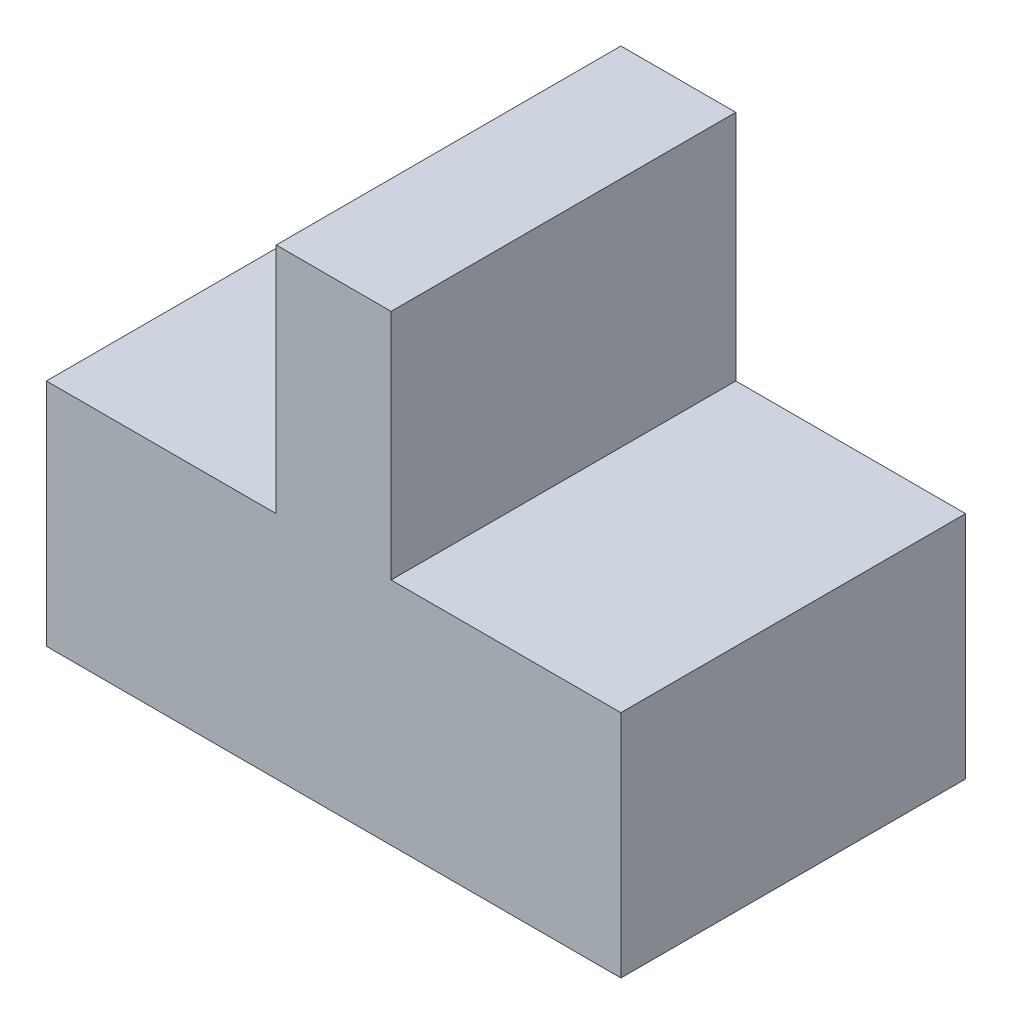
ISO-10303-21;
HEADER;
FILE_DESCRIPTION(('STEP AP214'),'2;1');
FILE_NAME('part.step','',(''),(''),'','','');
FILE_SCHEMA(('AUTOMOTIVE_DESIGN { 1 0 10303 214 1 1 1 1 }'));
ENDSEC;
DATA;
#1=APPLICATION_CONTEXT('core data for automotive mechanical design processes');
#2=APPLICATION_PROTOCOL_DEFINITION('international standard','automotive_design',2000,#1);
#3=PRODUCT_CONTEXT('',#1,'mechanical');
#4=PRODUCT('Part','Part','',(#3));
#5=PRODUCT_RELATED_PRODUCT_CATEGORY('part','',(#4));
#6=PRODUCT_DEFINITION_FORMATION('','',#4);
#7=PRODUCT_DEFINITION_CONTEXT('part definition',#1,'design');
#8=PRODUCT_DEFINITION('design','',#6,#7);
#9=PRODUCT_DEFINITION_SHAPE('','',#8);
#10=(LENGTH_UNIT() NAMED_UNIT(*) SI_UNIT(.MILLI.,.METRE.));
#11=(NAMED_UNIT(*) PLANE_ANGLE_UNIT() SI_UNIT($,.RADIAN.));
#12=(NAMED_UNIT(*) SI_UNIT($,.STERADIAN.) SOLID_ANGLE_UNIT());
#13=UNCERTAINTY_MEASURE_WITH_UNIT(LENGTH_MEASURE(1.E-05),#10,'distance_accuracy_value','');
#14=(GEOMETRIC_REPRESENTATION_CONTEXT(3) GLOBAL_UNCERTAINTY_ASSIGNED_CONTEXT((#13)) GLOBAL_UNIT_ASSIGNED_CONTEXT((#10,
#11,#12)) REPRESENTATION_CONTEXT('',''));
#15=CARTESIAN_POINT('',(0.,0.,0.));
#16=DIRECTION('',(0.,0.,1.));
#17=DIRECTION('',(1.,0.,0.));
#18=AXIS2_PLACEMENT_3D('',#15,#16,#17);
#19=CARTESIAN_POINT('',(0.,20.,30.));
#20=DIRECTION('',(1.,0.,0.));
#21=DIRECTION('',(0.,1.,0.));
#22=AXIS2_PLACEMENT_3D('',#19,#20,#21);
#23=PLANE('',#22);
#24=DIRECTION('',(0.,-1.,0.));
#25=VECTOR('',#24,1.);
#26=CARTESIAN_POINT('',(0.,20.,0.));
#27=LINE('',#26,#25);
#28=CARTESIAN_POINT('',(0.,20.,0.));
#29=VERTEX_POINT('',#28);
#30=CARTESIAN_POINT('',(0.,0.,0.));
#31=VERTEX_POINT('',#30);
#32=EDGE_CURVE('E144',#29,#31,#27,.T.);
#33=ORIENTED_EDGE('',*,*,#32,.T.);
#34=DIRECTION('',(0.,0.,-1.));
#35=VECTOR('',#34,1.);
#36=CARTESIAN_POINT('',(0.,0.,30.));
#37=LINE('',#36,#35);
#38=CARTESIAN_POINT('',(0.,0.,30.));
#39=VERTEX_POINT('',#38);
#40=EDGE_CURVE('E11',#39,#31,#37,.T.);
#41=ORIENTED_EDGE('',*,*,#40,.F.);
#42=DIRECTION('',(0.,-1.,0.));
#43=VECTOR('',#42,1.);
#44=CARTESIAN_POINT('',(0.,20.,30.));
#45=LINE('',#44,#43);
#46=CARTESIAN_POINT('',(0.,20.,30.));
#47=VERTEX_POINT('',#46);
#48=EDGE_CURVE('E166',#47,#39,#45,.T.);
#49=ORIENTED_EDGE('',*,*,#48,.F.);
#50=DIRECTION('',(0.,0.,-1.));
#51=VECTOR('',#50,1.);
#52=CARTESIAN_POINT('',(0.,20.,30.));
#53=LINE('',#52,#51);
#54=EDGE_CURVE('E140',#47,#29,#53,.T.);
#55=ORIENTED_EDGE('',*,*,#54,.T.);
#56=EDGE_LOOP('',(#33,#41,#49,#55));
#57=FACE_BOUND('',#56,.T.);
#58=ADVANCED_FACE('F43',(#57),#23,.F.);
#59=CARTESIAN_POINT('',(0.,0.,30.));
#60=DIRECTION('',(0.,1.,0.));
#61=DIRECTION('',(0.,0.,1.));
#62=AXIS2_PLACEMENT_3D('',#59,#60,#61);
#63=PLANE('',#62);
#64=DIRECTION('',(1.,0.,0.));
#65=VECTOR('',#64,1.);
#66=CARTESIAN_POINT('',(0.,0.,0.));
#67=LINE('',#66,#65);
#68=CARTESIAN_POINT('',(50.,0.,0.));
#69=VERTEX_POINT('',#68);
#70=EDGE_CURVE('E148',#31,#69,#67,.T.);
#71=ORIENTED_EDGE('',*,*,#70,.T.);
#72=DIRECTION('',(0.,0.,-1.));
#73=VECTOR('',#72,1.);
#74=CARTESIAN_POINT('',(50.,0.,30.));
#75=LINE('',#74,#73);
#76=CARTESIAN_POINT('',(50.,0.,30.));
#77=VERTEX_POINT('',#76);
#78=EDGE_CURVE('E52',#77,#69,#75,.T.);
#79=ORIENTED_EDGE('',*,*,#78,.F.);
#80=DIRECTION('',(1.,0.,0.));
#81=VECTOR('',#80,1.);
#82=CARTESIAN_POINT('',(0.,0.,30.));
#83=LINE('',#82,#81);
#84=EDGE_CURVE('E103',#39,#77,#83,.T.);
#85=ORIENTED_EDGE('',*,*,#84,.F.);
#86=ORIENTED_EDGE('',*,*,#40,.T.);
#87=EDGE_LOOP('',(#71,#79,#85,#86));
#88=FACE_BOUND('',#87,.T.);
#89=ADVANCED_FACE('F212',(#88),#63,.F.);
#90=CARTESIAN_POINT('',(50.,0.,30.));
#91=DIRECTION('',(-1.,0.,0.));
#92=DIRECTION('',(0.,0.,1.));
#93=AXIS2_PLACEMENT_3D('',#90,#91,#92);
#94=PLANE('',#93);
#95=DIRECTION('',(0.,1.,0.));
#96=VECTOR('',#95,1.);
#97=CARTESIAN_POINT('',(50.,0.,0.));
#98=LINE('',#97,#96);
#99=CARTESIAN_POINT('',(50.,20.,0.));
#100=VERTEX_POINT('',#99);
#101=EDGE_CURVE('E151',#69,#100,#98,.T.);
#102=ORIENTED_EDGE('',*,*,#101,.T.);
#103=DIRECTION('',(0.,0.,-1.));
#104=VECTOR('',#103,1.);
#105=CARTESIAN_POINT('',(50.,20.,30.));
#106=LINE('',#105,#104);
#107=CARTESIAN_POINT('',(50.,20.,30.));
#108=VERTEX_POINT('',#107);
#109=EDGE_CURVE('E177',#108,#100,#106,.T.);
#110=ORIENTED_EDGE('',*,*,#109,.F.);
#111=DIRECTION('',(0.,1.,0.));
#112=VECTOR('',#111,1.);
#113=CARTESIAN_POINT('',(50.,0.,30.));
#114=LINE('',#113,#112);
#115=EDGE_CURVE('E187',#77,#108,#114,.T.);
#116=ORIENTED_EDGE('',*,*,#115,.F.);
#117=ORIENTED_EDGE('',*,*,#78,.T.);
#118=EDGE_LOOP('',(#102,#110,#116,#117));
#119=FACE_BOUND('',#118,.T.);
#120=ADVANCED_FACE('F185',(#119),#94,.F.);
#121=CARTESIAN_POINT('',(50.,20.,30.));
#122=DIRECTION('',(0.,-1.,0.));
#123=DIRECTION('',(1.,0.,0.));
#124=AXIS2_PLACEMENT_3D('',#121,#122,#123);
#125=PLANE('',#124);
#126=DIRECTION('',(-1.,0.,0.));
#127=VECTOR('',#126,1.);
#128=CARTESIAN_POINT('',(50.,20.,0.));
#129=LINE('',#128,#127);
#130=CARTESIAN_POINT('',(30.,20.,0.));
#131=VERTEX_POINT('',#130);
#132=EDGE_CURVE('E154',#100,#131,#129,.T.);
#133=ORIENTED_EDGE('',*,*,#132,.T.);
#134=DIRECTION('',(0.,0.,-1.));
#135=VECTOR('',#134,1.);
#136=CARTESIAN_POINT('',(30.,20.,30.));
#137=LINE('',#136,#135);
#138=CARTESIAN_POINT('',(30.,20.,30.));
#139=VERTEX_POINT('',#138);
#140=EDGE_CURVE('E173',#139,#131,#137,.T.);
#141=ORIENTED_EDGE('',*,*,#140,.F.);
#142=DIRECTION('',(-1.,0.,0.));
#143=VECTOR('',#142,1.);
#144=CARTESIAN_POINT('',(50.,20.,30.));
#145=LINE('',#144,#143);
#146=EDGE_CURVE('E200',#108,#139,#145,.T.);
#147=ORIENTED_EDGE('',*,*,#146,.F.);
#148=ORIENTED_EDGE('',*,*,#109,.T.);
#149=EDGE_LOOP('',(#133,#141,#147,#148));
#150=FACE_BOUND('',#149,.T.);
#151=ADVANCED_FACE('F195',(#150),#125,.F.);
#152=CARTESIAN_POINT('',(30.,20.,30.));
#153=DIRECTION('',(-1.,0.,0.));
#154=DIRECTION('',(0.,0.,1.));
#155=AXIS2_PLACEMENT_3D('',#152,#153,#154);
#156=PLANE('',#155);
#157=DIRECTION('',(0.,1.,0.));
#158=VECTOR('',#157,1.);
#159=CARTESIAN_POINT('',(30.,20.,0.));
#160=LINE('',#159,#158);
#161=CARTESIAN_POINT('',(30.,40.2476776116107,0.));
#162=VERTEX_POINT('',#161);
#163=EDGE_CURVE('E157',#131,#162,#160,.T.);
#164=ORIENTED_EDGE('',*,*,#163,.T.);
#165=DIRECTION('',(0.,0.,-1.));
#166=VECTOR('',#165,1.);
#167=CARTESIAN_POINT('',(30.,40.2476776116107,30.));
#168=LINE('',#167,#166);
#169=CARTESIAN_POINT('',(30.,40.2476776116107,30.));
#170=VERTEX_POINT('',#169);
#171=EDGE_CURVE('E133',#170,#162,#168,.T.);
#172=ORIENTED_EDGE('',*,*,#171,.F.);
#173=DIRECTION('',(0.,1.,0.));
#174=VECTOR('',#173,1.);
#175=CARTESIAN_POINT('',(30.,20.,30.));
#176=LINE('',#175,#174);
#177=EDGE_CURVE('E122',#139,#170,#176,.T.);
#178=ORIENTED_EDGE('',*,*,#177,.F.);
#179=ORIENTED_EDGE('',*,*,#140,.T.);
#180=EDGE_LOOP('',(#164,#172,#178,#179));
#181=FACE_BOUND('',#180,.T.);
#182=ADVANCED_FACE('F198',(#181),#156,.F.);
#183=CARTESIAN_POINT('',(30.,40.2476776116107,30.));
#184=DIRECTION('',(0.,-1.,0.));
#185=DIRECTION('',(0.,0.,-1.));
#186=AXIS2_PLACEMENT_3D('',#183,#184,#185);
#187=PLANE('',#186);
#188=DIRECTION('',(-1.,0.,0.));
#189=VECTOR('',#188,1.);
#190=CARTESIAN_POINT('',(30.,40.2476776116107,0.));
#191=LINE('',#190,#189);
#192=CARTESIAN_POINT('',(20.,40.2476776116107,0.));
#193=VERTEX_POINT('',#192);
#194=EDGE_CURVE('E131',#162,#193,#191,.T.);
#195=ORIENTED_EDGE('',*,*,#194,.T.);
#196=DIRECTION('',(0.,0.,-1.));
#197=VECTOR('',#196,1.);
#198=CARTESIAN_POINT('',(20.,40.2476776116107,30.));
#199=LINE('',#198,#197);
#200=CARTESIAN_POINT('',(20.,40.2476776116107,30.));
#201=VERTEX_POINT('',#200);
#202=EDGE_CURVE('E128',#201,#193,#199,.T.);
#203=ORIENTED_EDGE('',*,*,#202,.F.);
#204=DIRECTION('',(-1.,0.,0.));
#205=VECTOR('',#204,1.);
#206=CARTESIAN_POINT('',(30.,40.2476776116107,30.));
#207=LINE('',#206,#205);
#208=EDGE_CURVE('E116',#170,#201,#207,.T.);
#209=ORIENTED_EDGE('',*,*,#208,.F.);
#210=ORIENTED_EDGE('',*,*,#171,.T.);
#211=EDGE_LOOP('',(#195,#203,#209,#210));
#212=FACE_BOUND('',#211,.T.);
#213=ADVANCED_FACE('F129',(#212),#187,.F.);
#214=CARTESIAN_POINT('',(20.,40.2476776116107,30.));
#215=DIRECTION('',(1.,0.,0.));
#216=DIRECTION('',(0.,0.,-1.));
#217=AXIS2_PLACEMENT_3D('',#214,#215,#216);
#218=PLANE('',#217);
#219=DIRECTION('',(0.,-1.,0.));
#220=VECTOR('',#219,1.);
#221=CARTESIAN_POINT('',(20.,40.2476776116107,0.));
#222=LINE('',#221,#220);
#223=CARTESIAN_POINT('',(20.,20.,0.));
#224=VERTEX_POINT('',#223);
#225=EDGE_CURVE('E89',#193,#224,#222,.T.);
#226=ORIENTED_EDGE('',*,*,#225,.T.);
#227=DIRECTION('',(0.,0.,-1.));
#228=VECTOR('',#227,1.);
#229=CARTESIAN_POINT('',(20.,20.,30.));
#230=LINE('',#229,#228);
#231=CARTESIAN_POINT('',(20.,20.,30.));
#232=VERTEX_POINT('',#231);
#233=EDGE_CURVE('E134',#232,#224,#230,.T.);
#234=ORIENTED_EDGE('',*,*,#233,.F.);
#235=DIRECTION('',(0.,-1.,0.));
#236=VECTOR('',#235,1.);
#237=CARTESIAN_POINT('',(20.,40.2476776116107,30.));
#238=LINE('',#237,#236);
#239=EDGE_CURVE('E120',#201,#232,#238,.T.);
#240=ORIENTED_EDGE('',*,*,#239,.F.);
#241=ORIENTED_EDGE('',*,*,#202,.T.);
#242=EDGE_LOOP('',(#226,#234,#240,#241));
#243=FACE_BOUND('',#242,.T.);
#244=ADVANCED_FACE('F136',(#243),#218,.F.);
#245=CARTESIAN_POINT('',(20.,20.,30.));
#246=DIRECTION('',(0.,-1.,0.));
#247=DIRECTION('',(1.,0.,0.));
#248=AXIS2_PLACEMENT_3D('',#245,#246,#247);
#249=PLANE('',#248);
#250=DIRECTION('',(-1.,0.,0.));
#251=VECTOR('',#250,1.);
#252=CARTESIAN_POINT('',(20.,20.,0.));
#253=LINE('',#252,#251);
#254=EDGE_CURVE('E95',#224,#29,#253,.T.);
#255=ORIENTED_EDGE('',*,*,#254,.T.);
#256=ORIENTED_EDGE('',*,*,#54,.F.);
#257=DIRECTION('',(-1.,0.,0.));
#258=VECTOR('',#257,1.);
#259=CARTESIAN_POINT('',(20.,20.,30.));
#260=LINE('',#259,#258);
#261=EDGE_CURVE('E60',#232,#47,#260,.T.);
#262=ORIENTED_EDGE('',*,*,#261,.F.);
#263=ORIENTED_EDGE('',*,*,#233,.T.);
#264=EDGE_LOOP('',(#255,#256,#262,#263));
#265=FACE_BOUND('',#264,.T.);
#266=ADVANCED_FACE('F228',(#265),#249,.F.);
#267=CARTESIAN_POINT('',(0.,0.,30.));
#268=DIRECTION('',(0.,0.,1.));
#269=DIRECTION('',(1.,0.,0.));
#270=AXIS2_PLACEMENT_3D('',#267,#268,#269);
#271=PLANE('',#270);
#272=ORIENTED_EDGE('',*,*,#48,.T.);
#273=ORIENTED_EDGE('',*,*,#84,.T.);
#274=ORIENTED_EDGE('',*,*,#115,.T.);
#275=ORIENTED_EDGE('',*,*,#146,.T.);
#276=ORIENTED_EDGE('',*,*,#177,.T.);
#277=ORIENTED_EDGE('',*,*,#208,.T.);
#278=ORIENTED_EDGE('',*,*,#239,.T.);
#279=ORIENTED_EDGE('',*,*,#261,.T.);
#280=EDGE_LOOP('',(#272,#273,#274,#275,#276,#277,#278,#279));
#281=FACE_BOUND('',#280,.T.);
#282=ADVANCED_FACE('F118',(#281),#271,.T.);
#283=CARTESIAN_POINT('',(0.,0.,0.));
#284=DIRECTION('',(0.,0.,1.));
#285=DIRECTION('',(1.,0.,0.));
#286=AXIS2_PLACEMENT_3D('',#283,#284,#285);
#287=PLANE('',#286);
#288=ORIENTED_EDGE('',*,*,#32,.F.);
#289=ORIENTED_EDGE('',*,*,#254,.F.);
#290=ORIENTED_EDGE('',*,*,#225,.F.);
#291=ORIENTED_EDGE('',*,*,#194,.F.);
#292=ORIENTED_EDGE('',*,*,#163,.F.);
#293=ORIENTED_EDGE('',*,*,#132,.F.);
#294=ORIENTED_EDGE('',*,*,#101,.F.);
#295=ORIENTED_EDGE('',*,*,#70,.F.);
#296=EDGE_LOOP('',(#288,#289,#290,#291,#292,#293,#294,#295));
#297=FACE_BOUND('',#296,.T.);
#298=ADVANCED_FACE('F191',(#297),#287,.F.);
#299=CLOSED_SHELL('',(#58,#89,#120,#151,#182,#213,#244,#266,#282,#298));
#300=MANIFOLD_SOLID_BREP('B2',#299);
#301=ADVANCED_BREP_SHAPE_REPRESENTATION('',(#18,#300),#14);
#302=SHAPE_DEFINITION_REPRESENTATION(#9,#301);
ENDSEC;
END-ISO-10303-21;
